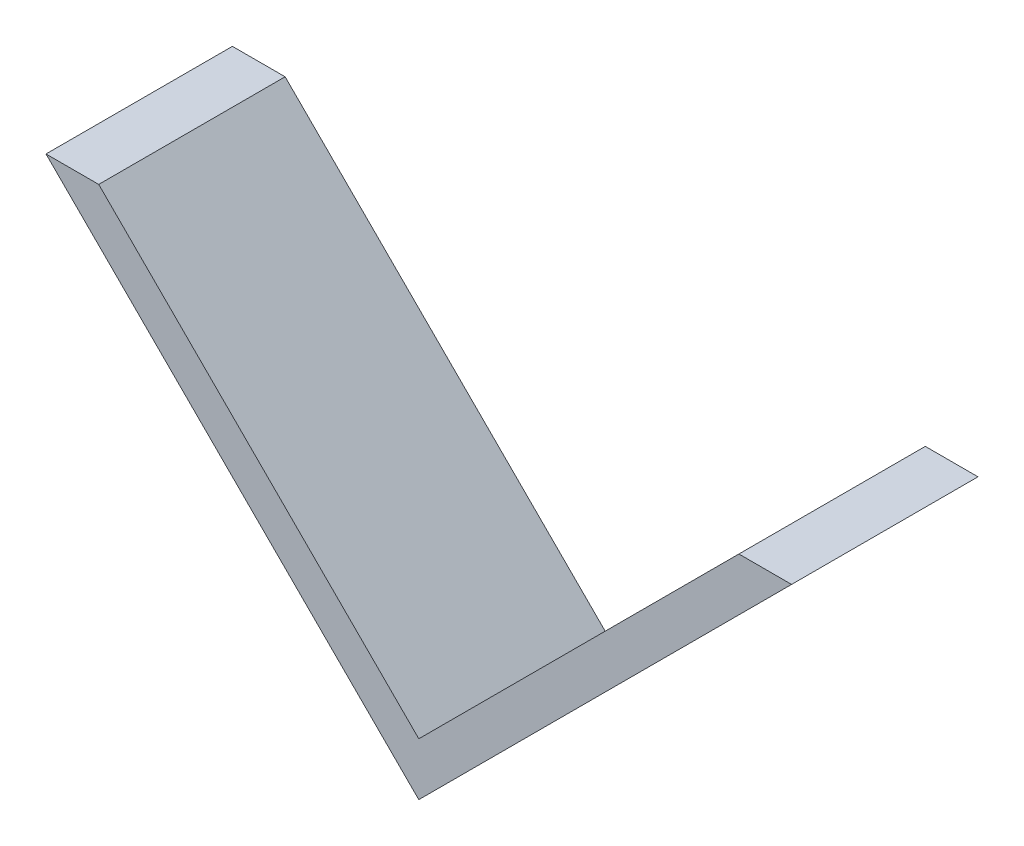
ISO-10303-21;
HEADER;
FILE_DESCRIPTION(('STEP AP214'),'2;1');
FILE_NAME('part.step','',(''),(''),'','','');
FILE_SCHEMA(('AUTOMOTIVE_DESIGN { 1 0 10303 214 1 1 1 1 }'));
ENDSEC;
DATA;
#1=APPLICATION_CONTEXT('core data for automotive mechanical design processes');
#2=APPLICATION_PROTOCOL_DEFINITION('international standard','automotive_design',2000,#1);
#3=PRODUCT_CONTEXT('',#1,'mechanical');
#4=PRODUCT('Part','Part','',(#3));
#5=PRODUCT_RELATED_PRODUCT_CATEGORY('part','',(#4));
#6=PRODUCT_DEFINITION_FORMATION('','',#4);
#7=PRODUCT_DEFINITION_CONTEXT('part definition',#1,'design');
#8=PRODUCT_DEFINITION('design','',#6,#7);
#9=PRODUCT_DEFINITION_SHAPE('','',#8);
#10=(LENGTH_UNIT() NAMED_UNIT(*) SI_UNIT(.MILLI.,.METRE.));
#11=(NAMED_UNIT(*) PLANE_ANGLE_UNIT() SI_UNIT($,.RADIAN.));
#12=(NAMED_UNIT(*) SI_UNIT($,.STERADIAN.) SOLID_ANGLE_UNIT());
#13=UNCERTAINTY_MEASURE_WITH_UNIT(LENGTH_MEASURE(1.E-05),#10,'distance_accuracy_value','');
#14=(GEOMETRIC_REPRESENTATION_CONTEXT(3) GLOBAL_UNCERTAINTY_ASSIGNED_CONTEXT((#13)) GLOBAL_UNIT_ASSIGNED_CONTEXT((#10,
#11,#12)) REPRESENTATION_CONTEXT('',''));
#15=CARTESIAN_POINT('',(0.,0.,0.));
#16=DIRECTION('',(0.,0.,1.));
#17=DIRECTION('',(1.,0.,0.));
#18=AXIS2_PLACEMENT_3D('',#15,#16,#17);
#19=CARTESIAN_POINT('',(19.9999999999999,20.,5.));
#20=DIRECTION('',(0.,-1.,0.));
#21=DIRECTION('',(0.,0.,-1.));
#22=AXIS2_PLACEMENT_3D('',#19,#20,#21);
#23=PLANE('',#22);
#24=DIRECTION('',(-1.,0.,0.));
#25=VECTOR('',#24,1.);
#26=CARTESIAN_POINT('',(19.9999999999999,20.,-5.));
#27=LINE('',#26,#25);
#28=CARTESIAN_POINT('',(19.9999999999999,20.,-5.));
#29=VERTEX_POINT('',#28);
#30=CARTESIAN_POINT('',(17.1715728752537,20.,-5.));
#31=VERTEX_POINT('',#30);
#32=EDGE_CURVE('E117',#29,#31,#27,.T.);
#33=ORIENTED_EDGE('',*,*,#32,.T.);
#34=DIRECTION('',(0.,0.,1.));
#35=VECTOR('',#34,1.);
#36=CARTESIAN_POINT('',(17.1715728752537,20.,-5.));
#37=LINE('',#36,#35);
#38=CARTESIAN_POINT('',(17.1715728752537,20.,5.));
#39=VERTEX_POINT('',#38);
#40=EDGE_CURVE('E101',#31,#39,#37,.T.);
#41=ORIENTED_EDGE('',*,*,#40,.T.);
#42=DIRECTION('',(-1.,0.,0.));
#43=VECTOR('',#42,1.);
#44=CARTESIAN_POINT('',(19.9999999999999,20.,5.));
#45=LINE('',#44,#43);
#46=CARTESIAN_POINT('',(19.9999999999999,20.,5.));
#47=VERTEX_POINT('',#46);
#48=EDGE_CURVE('E134',#47,#39,#45,.T.);
#49=ORIENTED_EDGE('',*,*,#48,.F.);
#50=DIRECTION('',(0.,0.,-1.));
#51=VECTOR('',#50,1.);
#52=CARTESIAN_POINT('',(19.9999999999999,20.,5.));
#53=LINE('',#52,#51);
#54=EDGE_CURVE('E48',#47,#29,#53,.T.);
#55=ORIENTED_EDGE('',*,*,#54,.T.);
#56=EDGE_LOOP('',(#33,#41,#49,#55));
#57=FACE_BOUND('',#56,.T.);
#58=ADVANCED_FACE('F39',(#57),#23,.F.);
#59=CARTESIAN_POINT('',(-19.9999999999999,20.,5.));
#60=DIRECTION('',(0.707106781186549,0.707106781186546,0.));
#61=DIRECTION('',(-0.707106781186546,0.707106781186549,0.));
#62=AXIS2_PLACEMENT_3D('',#59,#60,#61);
#63=PLANE('',#62);
#64=DIRECTION('',(0.707106781186546,-0.707106781186549,0.));
#65=VECTOR('',#64,1.);
#66=CARTESIAN_POINT('',(-19.9999999999999,20.,-5.));
#67=LINE('',#66,#65);
#68=CARTESIAN_POINT('',(-19.9999999999999,20.,-5.));
#69=VERTEX_POINT('',#68);
#70=CARTESIAN_POINT('',(0.,0.,-5.));
#71=VERTEX_POINT('',#70);
#72=EDGE_CURVE('E141',#69,#71,#67,.T.);
#73=ORIENTED_EDGE('',*,*,#72,.T.);
#74=DIRECTION('',(0.,0.,-1.));
#75=VECTOR('',#74,1.);
#76=CARTESIAN_POINT('',(0.,0.,5.));
#77=LINE('',#76,#75);
#78=CARTESIAN_POINT('',(0.,0.,5.));
#79=VERTEX_POINT('',#78);
#80=EDGE_CURVE('E11',#79,#71,#77,.T.);
#81=ORIENTED_EDGE('',*,*,#80,.F.);
#82=DIRECTION('',(0.707106781186546,-0.707106781186549,0.));
#83=VECTOR('',#82,1.);
#84=CARTESIAN_POINT('',(-19.9999999999999,20.,5.));
#85=LINE('',#84,#83);
#86=CARTESIAN_POINT('',(-19.9999999999999,20.,5.));
#87=VERTEX_POINT('',#86);
#88=EDGE_CURVE('E123',#87,#79,#85,.T.);
#89=ORIENTED_EDGE('',*,*,#88,.F.);
#90=DIRECTION('',(0.,0.,-1.));
#91=VECTOR('',#90,1.);
#92=CARTESIAN_POINT('',(-19.9999999999999,20.,5.));
#93=LINE('',#92,#91);
#94=EDGE_CURVE('E132',#87,#69,#93,.T.);
#95=ORIENTED_EDGE('',*,*,#94,.T.);
#96=EDGE_LOOP('',(#73,#81,#89,#95));
#97=FACE_BOUND('',#96,.T.);
#98=ADVANCED_FACE('F41',(#97),#63,.F.);
#99=CARTESIAN_POINT('',(0.,0.,5.));
#100=DIRECTION('',(-0.707106781186549,0.707106781186546,0.));
#101=DIRECTION('',(-0.707106781186546,-0.707106781186549,0.));
#102=AXIS2_PLACEMENT_3D('',#99,#100,#101);
#103=PLANE('',#102);
#104=DIRECTION('',(0.707106781186546,0.707106781186549,0.));
#105=VECTOR('',#104,1.);
#106=CARTESIAN_POINT('',(0.,0.,-5.));
#107=LINE('',#106,#105);
#108=EDGE_CURVE('E128',#71,#29,#107,.T.);
#109=ORIENTED_EDGE('',*,*,#108,.T.);
#110=ORIENTED_EDGE('',*,*,#54,.F.);
#111=DIRECTION('',(0.707106781186546,0.707106781186549,0.));
#112=VECTOR('',#111,1.);
#113=CARTESIAN_POINT('',(0.,0.,5.));
#114=LINE('',#113,#112);
#115=EDGE_CURVE('E87',#79,#47,#114,.T.);
#116=ORIENTED_EDGE('',*,*,#115,.F.);
#117=ORIENTED_EDGE('',*,*,#80,.T.);
#118=EDGE_LOOP('',(#109,#110,#116,#117));
#119=FACE_BOUND('',#118,.T.);
#120=ADVANCED_FACE('F171',(#119),#103,.F.);
#121=CARTESIAN_POINT('',(-17.1715728752537,20.,5.));
#122=VERTEX_POINT('',#121);
#123=EDGE_CURVE('E64',#122,#87,#45,.T.);
#124=ORIENTED_EDGE('',*,*,#123,.F.);
#125=DIRECTION('',(0.,0.,1.));
#126=VECTOR('',#125,1.);
#127=CARTESIAN_POINT('',(-17.1715728752537,20.,-5.));
#128=LINE('',#127,#126);
#129=CARTESIAN_POINT('',(-17.1715728752537,20.,-5.));
#130=VERTEX_POINT('',#129);
#131=EDGE_CURVE('E110',#130,#122,#128,.T.);
#132=ORIENTED_EDGE('',*,*,#131,.F.);
#133=EDGE_CURVE('E82',#130,#69,#27,.T.);
#134=ORIENTED_EDGE('',*,*,#133,.T.);
#135=ORIENTED_EDGE('',*,*,#94,.F.);
#136=EDGE_LOOP('',(#124,#132,#134,#135));
#137=FACE_BOUND('',#136,.T.);
#138=ADVANCED_FACE('F164',(#137),#23,.F.);
#139=CARTESIAN_POINT('',(0.,0.,5.));
#140=DIRECTION('',(0.,0.,1.));
#141=DIRECTION('',(1.,0.,0.));
#142=AXIS2_PLACEMENT_3D('',#139,#140,#141);
#143=PLANE('',#142);
#144=DIRECTION('',(0.707106781186547,0.707106781186548,0.));
#145=VECTOR('',#144,1.);
#146=CARTESIAN_POINT('',(17.1715728752537,20.,5.));
#147=LINE('',#146,#145);
#148=CARTESIAN_POINT('',(0.,2.82842712474626,5.));
#149=VERTEX_POINT('',#148);
#150=EDGE_CURVE('E104',#149,#39,#147,.T.);
#151=ORIENTED_EDGE('',*,*,#150,.F.);
#152=DIRECTION('',(0.707106781186548,-0.707106781186547,0.));
#153=VECTOR('',#152,1.);
#154=CARTESIAN_POINT('',(0.,2.82842712474626,5.));
#155=LINE('',#154,#153);
#156=EDGE_CURVE('E119',#122,#149,#155,.T.);
#157=ORIENTED_EDGE('',*,*,#156,.F.);
#158=ORIENTED_EDGE('',*,*,#123,.T.);
#159=ORIENTED_EDGE('',*,*,#88,.T.);
#160=ORIENTED_EDGE('',*,*,#115,.T.);
#161=ORIENTED_EDGE('',*,*,#48,.T.);
#162=EDGE_LOOP('',(#151,#157,#158,#159,#160,#161));
#163=FACE_BOUND('',#162,.T.);
#164=ADVANCED_FACE('F162',(#163),#143,.T.);
#165=CARTESIAN_POINT('',(0.,0.,-5.));
#166=DIRECTION('',(0.,0.,1.));
#167=DIRECTION('',(1.,0.,0.));
#168=AXIS2_PLACEMENT_3D('',#165,#166,#167);
#169=PLANE('',#168);
#170=DIRECTION('',(0.707106781186548,-0.707106781186547,0.));
#171=VECTOR('',#170,1.);
#172=CARTESIAN_POINT('',(0.,2.82842712474626,-5.));
#173=LINE('',#172,#171);
#174=CARTESIAN_POINT('',(0.,2.82842712474626,-5.));
#175=VERTEX_POINT('',#174);
#176=EDGE_CURVE('E111',#130,#175,#173,.T.);
#177=ORIENTED_EDGE('',*,*,#176,.T.);
#178=DIRECTION('',(0.707106781186547,0.707106781186548,0.));
#179=VECTOR('',#178,1.);
#180=CARTESIAN_POINT('',(17.1715728752537,20.,-5.));
#181=LINE('',#180,#179);
#182=EDGE_CURVE('E55',#175,#31,#181,.T.);
#183=ORIENTED_EDGE('',*,*,#182,.T.);
#184=ORIENTED_EDGE('',*,*,#32,.F.);
#185=ORIENTED_EDGE('',*,*,#108,.F.);
#186=ORIENTED_EDGE('',*,*,#72,.F.);
#187=ORIENTED_EDGE('',*,*,#133,.F.);
#188=EDGE_LOOP('',(#177,#183,#184,#185,#186,#187));
#189=FACE_BOUND('',#188,.T.);
#190=ADVANCED_FACE('F116',(#189),#169,.F.);
#191=CARTESIAN_POINT('',(17.1715728752537,20.,-5.));
#192=DIRECTION('',(0.707106781186548,-0.707106781186547,0.));
#193=DIRECTION('',(0.707106781186547,0.707106781186548,0.));
#194=AXIS2_PLACEMENT_3D('',#191,#192,#193);
#195=PLANE('',#194);
#196=ORIENTED_EDGE('',*,*,#150,.T.);
#197=ORIENTED_EDGE('',*,*,#40,.F.);
#198=ORIENTED_EDGE('',*,*,#182,.F.);
#199=DIRECTION('',(0.,0.,1.));
#200=VECTOR('',#199,1.);
#201=CARTESIAN_POINT('',(0.,2.82842712474626,-5.));
#202=LINE('',#201,#200);
#203=EDGE_CURVE('E144',#175,#149,#202,.T.);
#204=ORIENTED_EDGE('',*,*,#203,.T.);
#205=EDGE_LOOP('',(#196,#197,#198,#204));
#206=FACE_BOUND('',#205,.T.);
#207=ADVANCED_FACE('F102',(#206),#195,.F.);
#208=CARTESIAN_POINT('',(0.,2.82842712474626,-5.));
#209=DIRECTION('',(-0.707106781186547,-0.707106781186548,0.));
#210=DIRECTION('',(0.707106781186548,-0.707106781186547,0.));
#211=AXIS2_PLACEMENT_3D('',#208,#209,#210);
#212=PLANE('',#211);
#213=ORIENTED_EDGE('',*,*,#156,.T.);
#214=ORIENTED_EDGE('',*,*,#203,.F.);
#215=ORIENTED_EDGE('',*,*,#176,.F.);
#216=ORIENTED_EDGE('',*,*,#131,.T.);
#217=EDGE_LOOP('',(#213,#214,#215,#216));
#218=FACE_BOUND('',#217,.T.);
#219=ADVANCED_FACE('F161',(#218),#212,.F.);
#220=CLOSED_SHELL('',(#58,#98,#120,#138,#164,#190,#207,#219));
#221=MANIFOLD_SOLID_BREP('B2',#220);
#222=ADVANCED_BREP_SHAPE_REPRESENTATION('',(#18,#221),#14);
#223=SHAPE_DEFINITION_REPRESENTATION(#9,#222);
ENDSEC;
END-ISO-10303-21;
